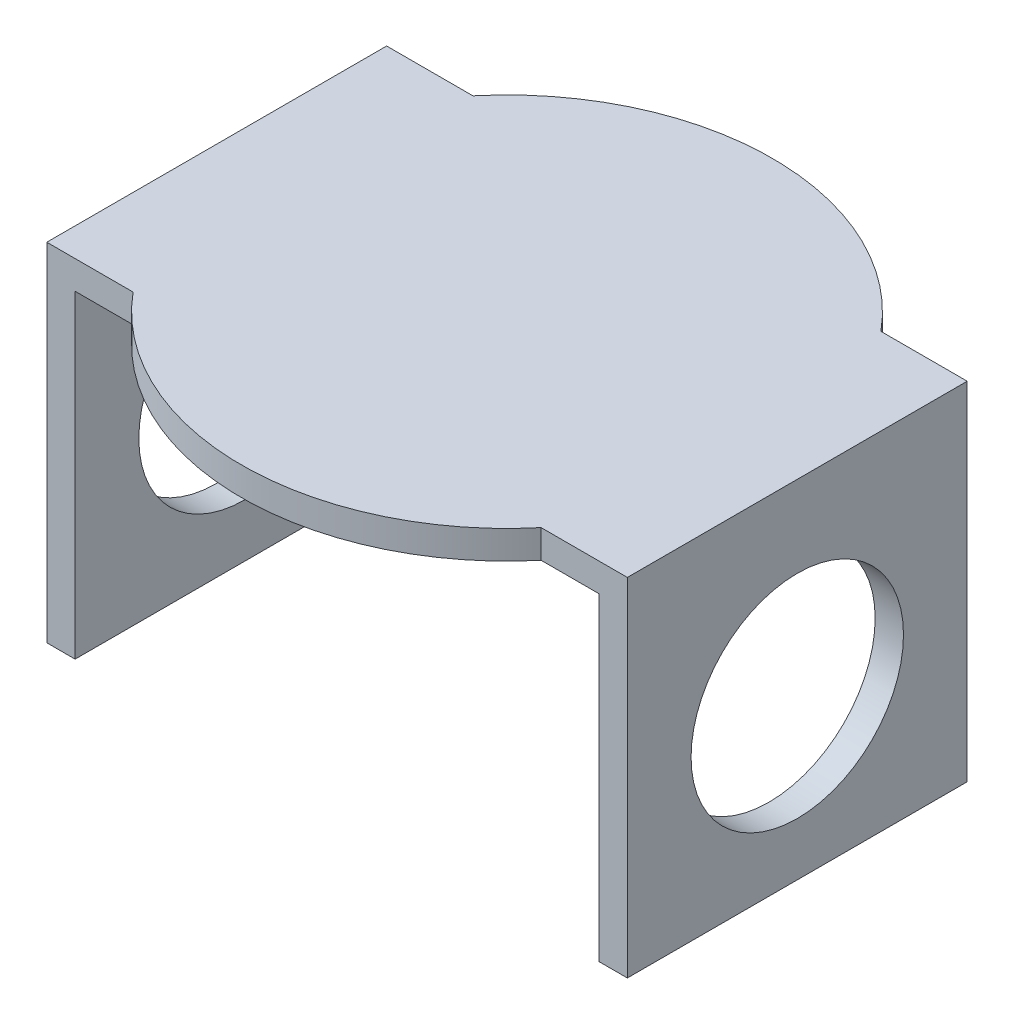
ISO-10303-21;
HEADER;
FILE_DESCRIPTION(('STEP AP214'),'2;1');
FILE_NAME('part.step','',(''),(''),'','','');
FILE_SCHEMA(('AUTOMOTIVE_DESIGN { 1 0 10303 214 1 1 1 1 }'));
ENDSEC;
DATA;
#1=APPLICATION_CONTEXT('core data for automotive mechanical design processes');
#2=APPLICATION_PROTOCOL_DEFINITION('international standard','automotive_design',2000,#1);
#3=PRODUCT_CONTEXT('',#1,'mechanical');
#4=PRODUCT('Part','Part','',(#3));
#5=PRODUCT_RELATED_PRODUCT_CATEGORY('part','',(#4));
#6=PRODUCT_DEFINITION_FORMATION('','',#4);
#7=PRODUCT_DEFINITION_CONTEXT('part definition',#1,'design');
#8=PRODUCT_DEFINITION('design','',#6,#7);
#9=PRODUCT_DEFINITION_SHAPE('','',#8);
#10=(LENGTH_UNIT() NAMED_UNIT(*) SI_UNIT(.MILLI.,.METRE.));
#11=(NAMED_UNIT(*) PLANE_ANGLE_UNIT() SI_UNIT($,.RADIAN.));
#12=(NAMED_UNIT(*) SI_UNIT($,.STERADIAN.) SOLID_ANGLE_UNIT());
#13=UNCERTAINTY_MEASURE_WITH_UNIT(LENGTH_MEASURE(1.E-05),#10,'distance_accuracy_value','');
#14=(GEOMETRIC_REPRESENTATION_CONTEXT(3) GLOBAL_UNCERTAINTY_ASSIGNED_CONTEXT((#13)) GLOBAL_UNIT_ASSIGNED_CONTEXT((#10,
#11,#12)) REPRESENTATION_CONTEXT('',''));
#15=CARTESIAN_POINT('',(0.,0.,0.));
#16=DIRECTION('',(0.,0.,1.));
#17=DIRECTION('',(1.,0.,0.));
#18=AXIS2_PLACEMENT_3D('',#15,#16,#17);
#19=CARTESIAN_POINT('',(0.,0.,96.));
#20=DIRECTION('',(0.,0.,-1.));
#21=DIRECTION('',(-1.,0.,0.));
#22=AXIS2_PLACEMENT_3D('',#19,#20,#21);
#23=PLANE('',#22);
#24=DIRECTION('',(1.,0.,0.));
#25=VECTOR('',#24,1.);
#26=CARTESIAN_POINT('',(74.,90.,96.));
#27=LINE('',#26,#25);
#28=CARTESIAN_POINT('',(-74.,90.,96.));
#29=VERTEX_POINT('',#28);
#30=CARTESIAN_POINT('',(-57.6281181368957,90.,96.));
#31=VERTEX_POINT('',#30);
#32=EDGE_CURVE('E50',#29,#31,#27,.T.);
#33=ORIENTED_EDGE('',*,*,#32,.T.);
#34=DIRECTION('',(0.,1.,0.));
#35=VECTOR('',#34,1.);
#36=CARTESIAN_POINT('',(-57.6281181368957,-122.132034355964,96.));
#37=LINE('',#36,#35);
#38=CARTESIAN_POINT('',(-57.6281181368957,98.,96.));
#39=VERTEX_POINT('',#38);
#40=EDGE_CURVE('E54',#31,#39,#37,.T.);
#41=ORIENTED_EDGE('',*,*,#40,.T.);
#42=DIRECTION('',(-1.,0.,0.));
#43=VECTOR('',#42,1.);
#44=CARTESIAN_POINT('',(-82.,98.,96.));
#45=LINE('',#44,#43);
#46=CARTESIAN_POINT('',(-82.,98.,96.));
#47=VERTEX_POINT('',#46);
#48=EDGE_CURVE('E198',#39,#47,#45,.T.);
#49=ORIENTED_EDGE('',*,*,#48,.T.);
#50=DIRECTION('',(0.,-1.,0.));
#51=VECTOR('',#50,1.);
#52=CARTESIAN_POINT('',(-82.,98.,96.));
#53=LINE('',#52,#51);
#54=CARTESIAN_POINT('',(-82.,0.,96.));
#55=VERTEX_POINT('',#54);
#56=EDGE_CURVE('E201',#47,#55,#53,.T.);
#57=ORIENTED_EDGE('',*,*,#56,.T.);
#58=DIRECTION('',(1.,0.,0.));
#59=VECTOR('',#58,1.);
#60=CARTESIAN_POINT('',(-82.,0.,96.));
#61=LINE('',#60,#59);
#62=CARTESIAN_POINT('',(-74.,0.,96.));
#63=VERTEX_POINT('',#62);
#64=EDGE_CURVE('E203',#55,#63,#61,.T.);
#65=ORIENTED_EDGE('',*,*,#64,.T.);
#66=DIRECTION('',(0.,1.,0.));
#67=VECTOR('',#66,1.);
#68=CARTESIAN_POINT('',(-74.,0.,96.));
#69=LINE('',#68,#67);
#70=EDGE_CURVE('E205',#63,#29,#69,.T.);
#71=ORIENTED_EDGE('',*,*,#70,.T.);
#72=EDGE_LOOP('',(#33,#41,#49,#57,#65,#71));
#73=FACE_BOUND('',#72,.T.);
#74=ADVANCED_FACE('F35',(#73),#23,.F.);
#75=CARTESIAN_POINT('',(0.,0.,0.));
#76=DIRECTION('',(0.,0.,-1.));
#77=DIRECTION('',(-1.,0.,0.));
#78=AXIS2_PLACEMENT_3D('',#75,#76,#77);
#79=PLANE('',#78);
#80=DIRECTION('',(0.,1.,0.));
#81=VECTOR('',#80,1.);
#82=CARTESIAN_POINT('',(-57.6281181368957,-122.132034355964,0.));
#83=LINE('',#82,#81);
#84=CARTESIAN_POINT('',(-57.6281181368957,90.,0.));
#85=VERTEX_POINT('',#84);
#86=CARTESIAN_POINT('',(-57.6281181368957,98.,0.));
#87=VERTEX_POINT('',#86);
#88=EDGE_CURVE('E11',#85,#87,#83,.T.);
#89=ORIENTED_EDGE('',*,*,#88,.F.);
#90=DIRECTION('',(1.,0.,0.));
#91=VECTOR('',#90,1.);
#92=CARTESIAN_POINT('',(74.,90.,0.));
#93=LINE('',#92,#91);
#94=CARTESIAN_POINT('',(-74.,90.,0.));
#95=VERTEX_POINT('',#94);
#96=EDGE_CURVE('E137',#95,#85,#93,.T.);
#97=ORIENTED_EDGE('',*,*,#96,.F.);
#98=DIRECTION('',(0.,1.,0.));
#99=VECTOR('',#98,1.);
#100=CARTESIAN_POINT('',(-74.,0.,0.));
#101=LINE('',#100,#99);
#102=CARTESIAN_POINT('',(-74.,0.,0.));
#103=VERTEX_POINT('',#102);
#104=EDGE_CURVE('E149',#103,#95,#101,.T.);
#105=ORIENTED_EDGE('',*,*,#104,.F.);
#106=DIRECTION('',(1.,0.,0.));
#107=VECTOR('',#106,1.);
#108=CARTESIAN_POINT('',(-82.,0.,0.));
#109=LINE('',#108,#107);
#110=CARTESIAN_POINT('',(-82.,0.,0.));
#111=VERTEX_POINT('',#110);
#112=EDGE_CURVE('E218',#111,#103,#109,.T.);
#113=ORIENTED_EDGE('',*,*,#112,.F.);
#114=DIRECTION('',(0.,-1.,0.));
#115=VECTOR('',#114,1.);
#116=CARTESIAN_POINT('',(-82.,98.,0.));
#117=LINE('',#116,#115);
#118=CARTESIAN_POINT('',(-82.,98.,0.));
#119=VERTEX_POINT('',#118);
#120=EDGE_CURVE('E217',#119,#111,#117,.T.);
#121=ORIENTED_EDGE('',*,*,#120,.F.);
#122=DIRECTION('',(-1.,0.,0.));
#123=VECTOR('',#122,1.);
#124=CARTESIAN_POINT('',(-82.,98.,0.));
#125=LINE('',#124,#123);
#126=EDGE_CURVE('E139',#87,#119,#125,.T.);
#127=ORIENTED_EDGE('',*,*,#126,.F.);
#128=EDGE_LOOP('',(#89,#97,#105,#113,#121,#127));
#129=FACE_BOUND('',#128,.T.);
#130=ADVANCED_FACE('F135',(#129),#79,.T.);
#131=CARTESIAN_POINT('',(82.,98.,96.));
#132=DIRECTION('',(-1.,0.,0.));
#133=DIRECTION('',(0.,-1.,0.));
#134=AXIS2_PLACEMENT_3D('',#131,#132,#133);
#135=PLANE('',#134);
#136=CARTESIAN_POINT('',(82.,45.,48.));
#137=DIRECTION('',(1.,0.,0.));
#138=DIRECTION('',(0.,1.,0.));
#139=AXIS2_PLACEMENT_3D('',#136,#137,#138);
#140=CIRCLE('',#139,30.);
#141=CARTESIAN_POINT('',(82.,75.,48.));
#142=VERTEX_POINT('',#141);
#143=EDGE_CURVE('E180',#142,#142,#140,.T.);
#144=ORIENTED_EDGE('',*,*,#143,.F.);
#145=EDGE_LOOP('',(#144));
#146=FACE_BOUND('',#145,.T.);
#147=DIRECTION('',(0.,1.,0.));
#148=VECTOR('',#147,1.);
#149=CARTESIAN_POINT('',(82.,98.,0.));
#150=LINE('',#149,#148);
#151=CARTESIAN_POINT('',(82.,0.,0.));
#152=VERTEX_POINT('',#151);
#153=CARTESIAN_POINT('',(82.,98.,0.));
#154=VERTEX_POINT('',#153);
#155=EDGE_CURVE('E195',#152,#154,#150,.T.);
#156=ORIENTED_EDGE('',*,*,#155,.T.);
#157=DIRECTION('',(0.,0.,-1.));
#158=VECTOR('',#157,1.);
#159=CARTESIAN_POINT('',(82.,98.,96.));
#160=LINE('',#159,#158);
#161=CARTESIAN_POINT('',(82.,98.,96.));
#162=VERTEX_POINT('',#161);
#163=EDGE_CURVE('E174',#162,#154,#160,.T.);
#164=ORIENTED_EDGE('',*,*,#163,.F.);
#165=DIRECTION('',(0.,1.,0.));
#166=VECTOR('',#165,1.);
#167=CARTESIAN_POINT('',(82.,98.,96.));
#168=LINE('',#167,#166);
#169=CARTESIAN_POINT('',(82.,0.,96.));
#170=VERTEX_POINT('',#169);
#171=EDGE_CURVE('E154',#170,#162,#168,.T.);
#172=ORIENTED_EDGE('',*,*,#171,.F.);
#173=DIRECTION('',(0.,0.,-1.));
#174=VECTOR('',#173,1.);
#175=CARTESIAN_POINT('',(82.,0.,96.));
#176=LINE('',#175,#174);
#177=EDGE_CURVE('E155',#170,#152,#176,.T.);
#178=ORIENTED_EDGE('',*,*,#177,.T.);
#179=EDGE_LOOP('',(#156,#164,#172,#178));
#180=FACE_BOUND('',#179,.T.);
#181=ADVANCED_FACE('F37',(#146,#180),#135,.F.);
#182=CARTESIAN_POINT('',(-82.,98.,96.));
#183=DIRECTION('',(0.,-1.,0.));
#184=DIRECTION('',(0.,0.,-1.));
#185=AXIS2_PLACEMENT_3D('',#182,#183,#184);
#186=PLANE('',#185);
#187=ORIENTED_EDGE('',*,*,#48,.F.);
#188=CARTESIAN_POINT('',(0.,98.,48.));
#189=DIRECTION('',(0.,1.,0.));
#190=DIRECTION('',(0.,0.,1.));
#191=AXIS2_PLACEMENT_3D('',#188,#189,#190);
#192=CIRCLE('',#191,75.);
#193=CARTESIAN_POINT('',(57.6281181368957,98.,96.));
#194=VERTEX_POINT('',#193);
#195=EDGE_CURVE('E237',#39,#194,#192,.T.);
#196=ORIENTED_EDGE('',*,*,#195,.T.);
#197=EDGE_CURVE('E199',#162,#194,#45,.T.);
#198=ORIENTED_EDGE('',*,*,#197,.F.);
#199=ORIENTED_EDGE('',*,*,#163,.T.);
#200=CARTESIAN_POINT('',(57.6281181368957,98.,0.));
#201=VERTEX_POINT('',#200);
#202=EDGE_CURVE('E214',#154,#201,#125,.T.);
#203=ORIENTED_EDGE('',*,*,#202,.T.);
#204=EDGE_CURVE('E236',#201,#87,#192,.T.);
#205=ORIENTED_EDGE('',*,*,#204,.T.);
#206=ORIENTED_EDGE('',*,*,#126,.T.);
#207=DIRECTION('',(0.,0.,-1.));
#208=VECTOR('',#207,1.);
#209=CARTESIAN_POINT('',(-82.,98.,96.));
#210=LINE('',#209,#208);
#211=EDGE_CURVE('E171',#47,#119,#210,.T.);
#212=ORIENTED_EDGE('',*,*,#211,.F.);
#213=EDGE_LOOP('',(#187,#196,#198,#199,#203,#205,#206,#212));
#214=FACE_BOUND('',#213,.T.);
#215=ADVANCED_FACE('F235',(#214),#186,.F.);
#216=CARTESIAN_POINT('',(-82.,98.,96.));
#217=DIRECTION('',(1.,0.,0.));
#218=DIRECTION('',(0.,1.,0.));
#219=AXIS2_PLACEMENT_3D('',#216,#217,#218);
#220=PLANE('',#219);
#221=CARTESIAN_POINT('',(-82.,45.,48.));
#222=DIRECTION('',(1.,0.,0.));
#223=DIRECTION('',(0.,1.,0.));
#224=AXIS2_PLACEMENT_3D('',#221,#222,#223);
#225=CIRCLE('',#224,30.);
#226=CARTESIAN_POINT('',(-82.,75.,48.));
#227=VERTEX_POINT('',#226);
#228=EDGE_CURVE('E184',#227,#227,#225,.T.);
#229=ORIENTED_EDGE('',*,*,#228,.T.);
#230=EDGE_LOOP('',(#229));
#231=FACE_BOUND('',#230,.T.);
#232=ORIENTED_EDGE('',*,*,#120,.T.);
#233=DIRECTION('',(0.,0.,-1.));
#234=VECTOR('',#233,1.);
#235=CARTESIAN_POINT('',(-82.,0.,96.));
#236=LINE('',#235,#234);
#237=EDGE_CURVE('E168',#55,#111,#236,.T.);
#238=ORIENTED_EDGE('',*,*,#237,.F.);
#239=ORIENTED_EDGE('',*,*,#56,.F.);
#240=ORIENTED_EDGE('',*,*,#211,.T.);
#241=EDGE_LOOP('',(#232,#238,#239,#240));
#242=FACE_BOUND('',#241,.T.);
#243=ADVANCED_FACE('F227',(#231,#242),#220,.F.);
#244=CARTESIAN_POINT('',(-82.,0.,96.));
#245=DIRECTION('',(0.,1.,0.));
#246=DIRECTION('',(-1.,0.,0.));
#247=AXIS2_PLACEMENT_3D('',#244,#245,#246);
#248=PLANE('',#247);
#249=ORIENTED_EDGE('',*,*,#112,.T.);
#250=DIRECTION('',(0.,0.,-1.));
#251=VECTOR('',#250,1.);
#252=CARTESIAN_POINT('',(-74.,0.,96.));
#253=LINE('',#252,#251);
#254=EDGE_CURVE('E165',#63,#103,#253,.T.);
#255=ORIENTED_EDGE('',*,*,#254,.F.);
#256=ORIENTED_EDGE('',*,*,#64,.F.);
#257=ORIENTED_EDGE('',*,*,#237,.T.);
#258=EDGE_LOOP('',(#249,#255,#256,#257));
#259=FACE_BOUND('',#258,.T.);
#260=ADVANCED_FACE('F231',(#259),#248,.F.);
#261=CARTESIAN_POINT('',(-74.,0.,96.));
#262=DIRECTION('',(-1.,0.,0.));
#263=DIRECTION('',(0.,0.,1.));
#264=AXIS2_PLACEMENT_3D('',#261,#262,#263);
#265=PLANE('',#264);
#266=CARTESIAN_POINT('',(-74.,45.,48.));
#267=DIRECTION('',(-1.,0.,0.));
#268=DIRECTION('',(0.,0.,1.));
#269=AXIS2_PLACEMENT_3D('',#266,#267,#268);
#270=CIRCLE('',#269,30.);
#271=CARTESIAN_POINT('',(-74.,45.,78.));
#272=VERTEX_POINT('',#271);
#273=EDGE_CURVE('E179',#272,#272,#270,.T.);
#274=ORIENTED_EDGE('',*,*,#273,.T.);
#275=EDGE_LOOP('',(#274));
#276=FACE_BOUND('',#275,.T.);
#277=ORIENTED_EDGE('',*,*,#104,.T.);
#278=DIRECTION('',(0.,0.,-1.));
#279=VECTOR('',#278,1.);
#280=CARTESIAN_POINT('',(-74.,90.,96.));
#281=LINE('',#280,#279);
#282=EDGE_CURVE('E142',#29,#95,#281,.T.);
#283=ORIENTED_EDGE('',*,*,#282,.F.);
#284=ORIENTED_EDGE('',*,*,#70,.F.);
#285=ORIENTED_EDGE('',*,*,#254,.T.);
#286=EDGE_LOOP('',(#277,#283,#284,#285));
#287=FACE_BOUND('',#286,.T.);
#288=ADVANCED_FACE('F223',(#276,#287),#265,.F.);
#289=CARTESIAN_POINT('',(74.,90.,96.));
#290=DIRECTION('',(0.,1.,0.));
#291=DIRECTION('',(0.,0.,1.));
#292=AXIS2_PLACEMENT_3D('',#289,#290,#291);
#293=PLANE('',#292);
#294=ORIENTED_EDGE('',*,*,#282,.T.);
#295=ORIENTED_EDGE('',*,*,#96,.T.);
#296=CARTESIAN_POINT('',(0.,90.,48.));
#297=DIRECTION('',(0.,1.,0.));
#298=DIRECTION('',(0.,0.,1.));
#299=AXIS2_PLACEMENT_3D('',#296,#297,#298);
#300=CIRCLE('',#299,75.);
#301=CARTESIAN_POINT('',(57.6281181368957,90.,0.));
#302=VERTEX_POINT('',#301);
#303=EDGE_CURVE('E120',#85,#302,#300,.F.);
#304=ORIENTED_EDGE('',*,*,#303,.T.);
#305=CARTESIAN_POINT('',(74.,90.,0.));
#306=VERTEX_POINT('',#305);
#307=EDGE_CURVE('E145',#302,#306,#93,.T.);
#308=ORIENTED_EDGE('',*,*,#307,.T.);
#309=DIRECTION('',(0.,0.,-1.));
#310=VECTOR('',#309,1.);
#311=CARTESIAN_POINT('',(74.,90.,96.));
#312=LINE('',#311,#310);
#313=CARTESIAN_POINT('',(74.,90.,96.));
#314=VERTEX_POINT('',#313);
#315=EDGE_CURVE('E162',#314,#306,#312,.T.);
#316=ORIENTED_EDGE('',*,*,#315,.F.);
#317=CARTESIAN_POINT('',(57.6281181368957,90.,96.));
#318=VERTEX_POINT('',#317);
#319=EDGE_CURVE('E207',#318,#314,#27,.T.);
#320=ORIENTED_EDGE('',*,*,#319,.F.);
#321=EDGE_CURVE('E130',#318,#31,#300,.F.);
#322=ORIENTED_EDGE('',*,*,#321,.T.);
#323=ORIENTED_EDGE('',*,*,#32,.F.);
#324=EDGE_LOOP('',(#294,#295,#304,#308,#316,#320,#322,#323));
#325=FACE_BOUND('',#324,.T.);
#326=ADVANCED_FACE('F140',(#325),#293,.F.);
#327=CARTESIAN_POINT('',(74.,0.,96.));
#328=DIRECTION('',(1.,0.,0.));
#329=DIRECTION('',(0.,0.,-1.));
#330=AXIS2_PLACEMENT_3D('',#327,#328,#329);
#331=PLANE('',#330);
#332=CARTESIAN_POINT('',(74.,45.,48.));
#333=DIRECTION('',(1.,0.,0.));
#334=DIRECTION('',(0.,0.,-1.));
#335=AXIS2_PLACEMENT_3D('',#332,#333,#334);
#336=CIRCLE('',#335,30.);
#337=CARTESIAN_POINT('',(74.,45.,18.));
#338=VERTEX_POINT('',#337);
#339=EDGE_CURVE('E177',#338,#338,#336,.T.);
#340=ORIENTED_EDGE('',*,*,#339,.T.);
#341=EDGE_LOOP('',(#340));
#342=FACE_BOUND('',#341,.T.);
#343=DIRECTION('',(0.,-1.,0.));
#344=VECTOR('',#343,1.);
#345=CARTESIAN_POINT('',(74.,0.,0.));
#346=LINE('',#345,#344);
#347=CARTESIAN_POINT('',(74.,0.,0.));
#348=VERTEX_POINT('',#347);
#349=EDGE_CURVE('E144',#306,#348,#346,.T.);
#350=ORIENTED_EDGE('',*,*,#349,.T.);
#351=DIRECTION('',(0.,0.,-1.));
#352=VECTOR('',#351,1.);
#353=CARTESIAN_POINT('',(74.,0.,96.));
#354=LINE('',#353,#352);
#355=CARTESIAN_POINT('',(74.,0.,96.));
#356=VERTEX_POINT('',#355);
#357=EDGE_CURVE('E158',#356,#348,#354,.T.);
#358=ORIENTED_EDGE('',*,*,#357,.F.);
#359=DIRECTION('',(0.,-1.,0.));
#360=VECTOR('',#359,1.);
#361=CARTESIAN_POINT('',(74.,0.,96.));
#362=LINE('',#361,#360);
#363=EDGE_CURVE('E209',#314,#356,#362,.T.);
#364=ORIENTED_EDGE('',*,*,#363,.F.);
#365=ORIENTED_EDGE('',*,*,#315,.T.);
#366=EDGE_LOOP('',(#350,#358,#364,#365));
#367=FACE_BOUND('',#366,.T.);
#368=ADVANCED_FACE('F252',(#342,#367),#331,.F.);
#369=CARTESIAN_POINT('',(82.,0.,96.));
#370=DIRECTION('',(0.,1.,0.));
#371=DIRECTION('',(-1.,0.,0.));
#372=AXIS2_PLACEMENT_3D('',#369,#370,#371);
#373=PLANE('',#372);
#374=DIRECTION('',(1.,0.,0.));
#375=VECTOR('',#374,1.);
#376=CARTESIAN_POINT('',(82.,0.,0.));
#377=LINE('',#376,#375);
#378=EDGE_CURVE('E147',#348,#152,#377,.T.);
#379=ORIENTED_EDGE('',*,*,#378,.T.);
#380=ORIENTED_EDGE('',*,*,#177,.F.);
#381=DIRECTION('',(1.,0.,0.));
#382=VECTOR('',#381,1.);
#383=CARTESIAN_POINT('',(82.,0.,96.));
#384=LINE('',#383,#382);
#385=EDGE_CURVE('E159',#356,#170,#384,.T.);
#386=ORIENTED_EDGE('',*,*,#385,.F.);
#387=ORIENTED_EDGE('',*,*,#357,.T.);
#388=EDGE_LOOP('',(#379,#380,#386,#387));
#389=FACE_BOUND('',#388,.T.);
#390=ADVANCED_FACE('F258',(#389),#373,.F.);
#391=ORIENTED_EDGE('',*,*,#197,.T.);
#392=DIRECTION('',(0.,1.,0.));
#393=VECTOR('',#392,1.);
#394=CARTESIAN_POINT('',(57.6281181368957,-122.132034355964,96.));
#395=LINE('',#394,#393);
#396=EDGE_CURVE('E129',#194,#318,#395,.F.);
#397=ORIENTED_EDGE('',*,*,#396,.T.);
#398=ORIENTED_EDGE('',*,*,#319,.T.);
#399=ORIENTED_EDGE('',*,*,#363,.T.);
#400=ORIENTED_EDGE('',*,*,#385,.T.);
#401=ORIENTED_EDGE('',*,*,#171,.T.);
#402=EDGE_LOOP('',(#391,#397,#398,#399,#400,#401));
#403=FACE_BOUND('',#402,.T.);
#404=ADVANCED_FACE('F244',(#403),#23,.F.);
#405=DIRECTION('',(0.,1.,0.));
#406=VECTOR('',#405,1.);
#407=CARTESIAN_POINT('',(57.6281181368957,-122.132034355964,0.));
#408=LINE('',#407,#406);
#409=EDGE_CURVE('E43',#201,#302,#408,.F.);
#410=ORIENTED_EDGE('',*,*,#409,.F.);
#411=ORIENTED_EDGE('',*,*,#202,.F.);
#412=ORIENTED_EDGE('',*,*,#155,.F.);
#413=ORIENTED_EDGE('',*,*,#378,.F.);
#414=ORIENTED_EDGE('',*,*,#349,.F.);
#415=ORIENTED_EDGE('',*,*,#307,.F.);
#416=EDGE_LOOP('',(#410,#411,#412,#413,#414,#415));
#417=FACE_BOUND('',#416,.T.);
#418=ADVANCED_FACE('F263',(#417),#79,.T.);
#419=CARTESIAN_POINT('',(-90.0000000000001,45.,48.));
#420=DIRECTION('',(1.,0.,0.));
#421=DIRECTION('',(0.,1.,0.));
#422=AXIS2_PLACEMENT_3D('',#419,#420,#421);
#423=CYLINDRICAL_SURFACE('',#422,30.);
#424=ORIENTED_EDGE('',*,*,#143,.T.);
#425=EDGE_LOOP('',(#424));
#426=FACE_BOUND('',#425,.T.);
#427=ORIENTED_EDGE('',*,*,#339,.F.);
#428=EDGE_LOOP('',(#427));
#429=FACE_BOUND('',#428,.T.);
#430=ADVANCED_FACE('F265',(#426,#429),#423,.F.);
#431=ORIENTED_EDGE('',*,*,#273,.F.);
#432=EDGE_LOOP('',(#431));
#433=FACE_BOUND('',#432,.T.);
#434=ORIENTED_EDGE('',*,*,#228,.F.);
#435=EDGE_LOOP('',(#434));
#436=FACE_BOUND('',#435,.T.);
#437=ADVANCED_FACE('F272',(#433,#436),#423,.F.);
#438=CARTESIAN_POINT('',(0.,-122.132034355964,48.));
#439=DIRECTION('',(0.,1.,0.));
#440=DIRECTION('',(0.,0.,1.));
#441=AXIS2_PLACEMENT_3D('',#438,#439,#440);
#442=CYLINDRICAL_SURFACE('',#441,75.);
#443=ORIENTED_EDGE('',*,*,#303,.F.);
#444=ORIENTED_EDGE('',*,*,#88,.T.);
#445=ORIENTED_EDGE('',*,*,#204,.F.);
#446=ORIENTED_EDGE('',*,*,#409,.T.);
#447=EDGE_LOOP('',(#443,#444,#445,#446));
#448=FACE_BOUND('',#447,.T.);
#449=ADVANCED_FACE('F122',(#448),#442,.T.);
#450=ORIENTED_EDGE('',*,*,#40,.F.);
#451=ORIENTED_EDGE('',*,*,#321,.F.);
#452=ORIENTED_EDGE('',*,*,#396,.F.);
#453=ORIENTED_EDGE('',*,*,#195,.F.);
#454=EDGE_LOOP('',(#450,#451,#452,#453));
#455=FACE_BOUND('',#454,.T.);
#456=ADVANCED_FACE('F247',(#455),#442,.T.);
#457=CLOSED_SHELL('',(#74,#130,#181,#215,#243,#260,#288,#326,#368,#390,#404,#418,#430,#437,#449,#456));
#458=MANIFOLD_SOLID_BREP('B2',#457);
#459=ADVANCED_BREP_SHAPE_REPRESENTATION('',(#18,#458),#14);
#460=SHAPE_DEFINITION_REPRESENTATION(#9,#459);
ENDSEC;
END-ISO-10303-21;
